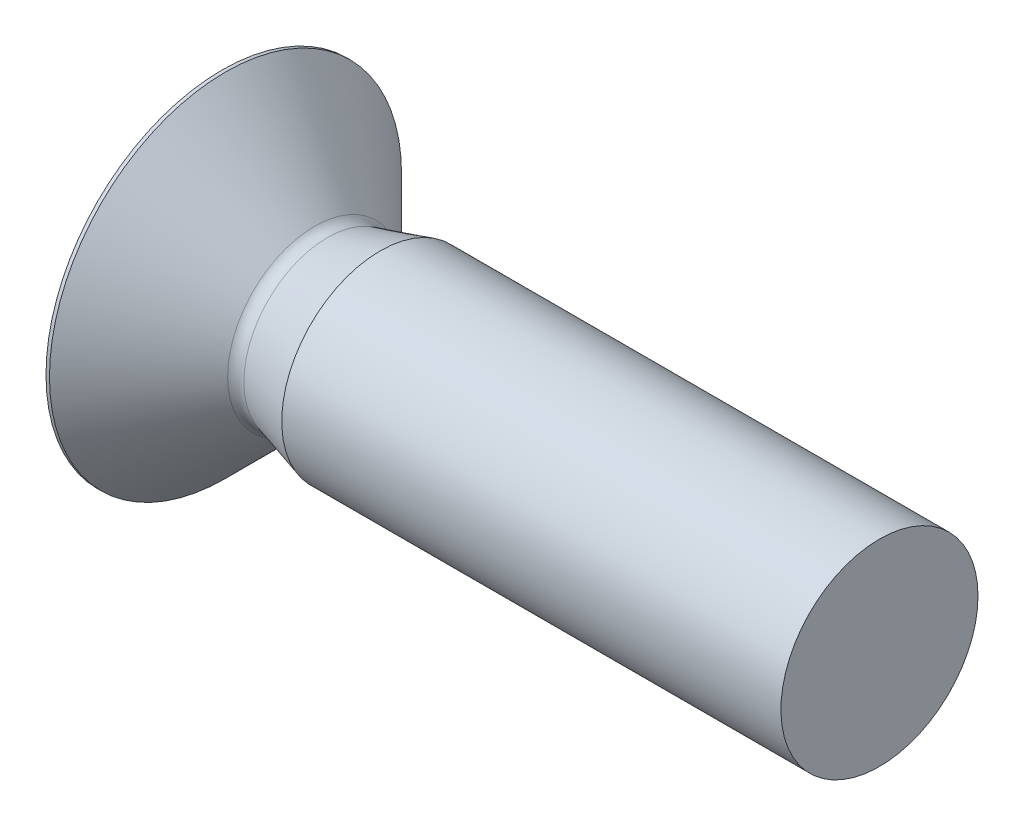
ISO-10303-21;
HEADER;
FILE_DESCRIPTION(('STEP AP214'),'2;1');
FILE_NAME('part.step','',(''),(''),'','','');
FILE_SCHEMA(('AUTOMOTIVE_DESIGN { 1 0 10303 214 1 1 1 1 }'));
ENDSEC;
DATA;
#1=APPLICATION_CONTEXT('core data for automotive mechanical design processes');
#2=APPLICATION_PROTOCOL_DEFINITION('international standard','automotive_design',2000,#1);
#3=PRODUCT_CONTEXT('',#1,'mechanical');
#4=PRODUCT('Part','Part','',(#3));
#5=PRODUCT_RELATED_PRODUCT_CATEGORY('part','',(#4));
#6=PRODUCT_DEFINITION_FORMATION('','',#4);
#7=PRODUCT_DEFINITION_CONTEXT('part definition',#1,'design');
#8=PRODUCT_DEFINITION('design','',#6,#7);
#9=PRODUCT_DEFINITION_SHAPE('','',#8);
#10=(LENGTH_UNIT() NAMED_UNIT(*) SI_UNIT(.MILLI.,.METRE.));
#11=(NAMED_UNIT(*) PLANE_ANGLE_UNIT() SI_UNIT($,.RADIAN.));
#12=(NAMED_UNIT(*) SI_UNIT($,.STERADIAN.) SOLID_ANGLE_UNIT());
#13=UNCERTAINTY_MEASURE_WITH_UNIT(LENGTH_MEASURE(1.E-05),#10,'distance_accuracy_value','');
#14=(GEOMETRIC_REPRESENTATION_CONTEXT(3) GLOBAL_UNCERTAINTY_ASSIGNED_CONTEXT((#13)) GLOBAL_UNIT_ASSIGNED_CONTEXT((#10,
#11,#12)) REPRESENTATION_CONTEXT('',''));
#15=CARTESIAN_POINT('',(0.,0.,0.));
#16=DIRECTION('',(0.,0.,1.));
#17=DIRECTION('',(1.,0.,0.));
#18=AXIS2_PLACEMENT_3D('',#15,#16,#17);
#19=CARTESIAN_POINT('',(13.1071334214584,0.,0.));
#20=DIRECTION('',(0.,0.,1.));
#21=DIRECTION('',(1.,0.,0.));
#22=AXIS2_PLACEMENT_3D('',#19,#20,#21);
#23=SPHERICAL_SURFACE('',#22,13.3871334214584);
#24=CARTESIAN_POINT('',(-0.00899944017152855,0.,0.));
#25=DIRECTION('',(1.,0.,0.));
#26=DIRECTION('',(0.,1.,0.));
#27=AXIS2_PLACEMENT_3D('',#24,#25,#26);
#28=CIRCLE('',#27,2.68);
#29=CARTESIAN_POINT('',(-0.00899944017152888,2.68,0.));
#30=VERTEX_POINT('',#29);
#31=EDGE_CURVE('E133',#30,#30,#28,.F.);
#32=ORIENTED_EDGE('',*,*,#31,.T.);
#33=EDGE_LOOP('',(#32));
#34=FACE_BOUND('',#33,.T.);
#35=CARTESIAN_POINT('',(13.1071334214584,-0.27,0.));
#36=DIRECTION('',(0.,1.,0.));
#37=DIRECTION('',(0.,0.,1.));
#38=AXIS2_PLACEMENT_3D('',#35,#36,#37);
#39=CIRCLE('',#38,13.3844103808845);
#40=CARTESIAN_POINT('',(-0.269022276047835,-0.27,0.47));
#41=VERTEX_POINT('',#40);
#42=CARTESIAN_POINT('',(-0.210260903935423,-0.27,1.3377031157536));
#43=VERTEX_POINT('',#42);
#44=EDGE_CURVE('E148',#41,#43,#39,.T.);
#45=ORIENTED_EDGE('',*,*,#44,.F.);
#46=CARTESIAN_POINT('',(-0.269022276047835,-0.27,0.47));
#47=CARTESIAN_POINT('',(-0.269417604811067,-0.26999042086414,0.458758558443646));
#48=CARTESIAN_POINT('',(-0.269778909741107,-0.270947211608083,0.44751857072811));
#49=CARTESIAN_POINT('',(-0.270424656000757,-0.274724233350607,0.42536218977667));
#50=CARTESIAN_POINT('',(-0.270709154802303,-0.277543065559565,0.414445560056996));
#51=CARTESIAN_POINT('',(-0.271193214650414,-0.284976947318594,0.393233392364227));
#52=CARTESIAN_POINT('',(-0.271392732508175,-0.28959290792535,0.382938172478185));
#53=CARTESIAN_POINT('',(-0.271701015779643,-0.300486494424591,0.363269218343669));
#54=CARTESIAN_POINT('',(-0.271809798340467,-0.306763806060175,0.353895310281603));
#55=CARTESIAN_POINT('',(-0.271933494681876,-0.320798281946317,0.336339697824952));
#56=CARTESIAN_POINT('',(-0.271948472551234,-0.328554432098189,0.328157183186532));
#57=CARTESIAN_POINT('',(-0.271884294423208,-0.345330886304446,0.313207627603959));
#58=CARTESIAN_POINT('',(-0.271805120395095,-0.354351432207329,0.306440858076476));
#59=CARTESIAN_POINT('',(-0.271554920408947,-0.373396806769295,0.294517566400965));
#60=CARTESIAN_POINT('',(-0.271383904227269,-0.383421528444114,0.289360872956922));
#61=CARTESIAN_POINT('',(-0.270954875852803,-0.404190180601211,0.280804286942104));
#62=CARTESIAN_POINT('',(-0.27069691305696,-0.414933699941671,0.277403399617276));
#63=CARTESIAN_POINT('',(-0.270202563341986,-0.433117931607286,0.273289762319187));
#64=CARTESIAN_POINT('',(-0.26998842314607,-0.440445829814385,0.272056778841486));
#65=CARTESIAN_POINT('',(-0.269528466888535,-0.455181650474478,0.270411990437571));
#66=CARTESIAN_POINT('',(-0.26928269629425,-0.462589444342723,0.269999020510423));
#67=CARTESIAN_POINT('',(-0.26902227604817,-0.469999999999803,0.269999999999089));
#68=B_SPLINE_CURVE_WITH_KNOTS('',3,(#46,#47,#48,#49,#50,#51,#52,#53,#54,#55,#56,#57,#58,#59,#60,
#61,#62,#63,#64,#65,#66,#67),.UNSPECIFIED.,.F.,.F.,(4,2,2,2,2,2,2,2,2,2,4),(0.,
0.0337007137509255,0.0673761398364029,0.101068660001112,0.134754811524532,0.168417945650886,
0.20208752753428,0.235753526088899,0.26940043014304,0.291659571944836,0.31388706728416),.UNSPECIFIED.);
#69=CARTESIAN_POINT('',(-0.269022276047835,-0.47,0.27));
#70=VERTEX_POINT('',#69);
#71=EDGE_CURVE('E223',#41,#70,#68,.T.);
#72=ORIENTED_EDGE('',*,*,#71,.T.);
#73=CARTESIAN_POINT('',(13.1071334214584,0.,0.27));
#74=DIRECTION('',(0.,0.,-1.));
#75=DIRECTION('',(0.,1.,0.));
#76=AXIS2_PLACEMENT_3D('',#73,#74,#75);
#77=CIRCLE('',#76,13.3844103808845);
#78=CARTESIAN_POINT('',(-0.210260903935423,-1.3377031157536,0.27));
#79=VERTEX_POINT('',#78);
#80=EDGE_CURVE('E186',#79,#70,#77,.T.);
#81=ORIENTED_EDGE('',*,*,#80,.F.);
#82=CARTESIAN_POINT('',(12.9343255522844,0.98004212673304,0.));
#83=DIRECTION('',(-0.173648177666931,0.984807753012208,0.));
#84=DIRECTION('',(-0.984807753012208,-0.173648177666931,0.));
#85=AXIS2_PLACEMENT_3D('',#82,#83,#84);
#86=CIRCLE('',#85,13.3500934870924);
#87=CARTESIAN_POINT('',(-0.210260903935423,-1.3377031157536,-0.270000000000001));
#88=VERTEX_POINT('',#87);
#89=EDGE_CURVE('E184',#88,#79,#86,.T.);
#90=ORIENTED_EDGE('',*,*,#89,.F.);
#91=CARTESIAN_POINT('',(13.1071334214584,0.,-0.270000000000001));
#92=DIRECTION('',(0.,0.,1.));
#93=DIRECTION('',(0.,-1.,0.));
#94=AXIS2_PLACEMENT_3D('',#91,#92,#93);
#95=CIRCLE('',#94,13.3844103808845);
#96=CARTESIAN_POINT('',(-0.269022276047835,-0.47,-0.270000000000001));
#97=VERTEX_POINT('',#96);
#98=EDGE_CURVE('E187',#97,#88,#95,.T.);
#99=ORIENTED_EDGE('',*,*,#98,.F.);
#100=CARTESIAN_POINT('',(-0.269022276047835,-0.47,-0.270000000000001));
#101=CARTESIAN_POINT('',(-0.269417604811068,-0.458758558443646,-0.26999042086414));
#102=CARTESIAN_POINT('',(-0.269778909741108,-0.447518570728111,-0.270947211608084));
#103=CARTESIAN_POINT('',(-0.270424656000757,-0.425362189776671,-0.274724233350608));
#104=CARTESIAN_POINT('',(-0.270709154802303,-0.414445560056996,-0.277543065559565));
#105=CARTESIAN_POINT('',(-0.271193214650414,-0.393233392364227,-0.284976947318594));
#106=CARTESIAN_POINT('',(-0.271392732508176,-0.382938172478185,-0.289592907925351));
#107=CARTESIAN_POINT('',(-0.271701015779643,-0.363269218343669,-0.300486494424591));
#108=CARTESIAN_POINT('',(-0.271809798340465,-0.353895310281603,-0.306763806060176));
#109=CARTESIAN_POINT('',(-0.271933494681874,-0.336339697824953,-0.320798281946318));
#110=CARTESIAN_POINT('',(-0.271948472551234,-0.328157183186532,-0.32855443209819));
#111=CARTESIAN_POINT('',(-0.271884294423209,-0.313207627603959,-0.345330886304446));
#112=CARTESIAN_POINT('',(-0.271805120395095,-0.306440858076477,-0.35435143220733));
#113=CARTESIAN_POINT('',(-0.271554920408947,-0.294517566400965,-0.373396806769295));
#114=CARTESIAN_POINT('',(-0.271383904227269,-0.289360872956922,-0.383421528444114));
#115=CARTESIAN_POINT('',(-0.270954875852803,-0.280804286942105,-0.404190180601211));
#116=CARTESIAN_POINT('',(-0.27069691305696,-0.277403399617277,-0.414933699941672));
#117=CARTESIAN_POINT('',(-0.270202563341986,-0.273289762319187,-0.433117931607287));
#118=CARTESIAN_POINT('',(-0.26998842314607,-0.272056778841487,-0.440445829814386));
#119=CARTESIAN_POINT('',(-0.269528466888535,-0.270411990437571,-0.455181650474478));
#120=CARTESIAN_POINT('',(-0.26928269629425,-0.269999020510424,-0.462589444342724));
#121=CARTESIAN_POINT('',(-0.26902227604817,-0.269999999999089,-0.469999999999804));
#122=B_SPLINE_CURVE_WITH_KNOTS('',3,(#100,#101,#102,#103,#104,#105,#106,#107,#108,#109,#110,
#111,#112,#113,#114,#115,#116,#117,#118,#119,#120,#121),.UNSPECIFIED.,.F.,.F.,(4,2,2,2,2,2,2,2,
2,2,4),(0.,0.0337007137509256,0.067376139836403,0.101068660001112,0.134754811524532,
0.168417945650886,0.20208752753428,0.235753526088899,0.26940043014304,0.291659571944836,
0.31388706728416),.UNSPECIFIED.);
#123=CARTESIAN_POINT('',(-0.269022276047835,-0.27,-0.47));
#124=VERTEX_POINT('',#123);
#125=EDGE_CURVE('E232',#97,#124,#122,.T.);
#126=ORIENTED_EDGE('',*,*,#125,.T.);
#127=CARTESIAN_POINT('',(13.1071334214584,-0.27,0.));
#128=DIRECTION('',(0.,1.,0.));
#129=DIRECTION('',(0.,0.,1.));
#130=AXIS2_PLACEMENT_3D('',#127,#128,#129);
#131=CIRCLE('',#130,13.3844103808845);
#132=CARTESIAN_POINT('',(-0.210260903935423,-0.27,-1.3377031157536));
#133=VERTEX_POINT('',#132);
#134=EDGE_CURVE('E163',#133,#124,#131,.T.);
#135=ORIENTED_EDGE('',*,*,#134,.F.);
#136=CARTESIAN_POINT('',(12.9343255522844,0.,0.98004212673304));
#137=DIRECTION('',(-0.173648177666931,0.,0.984807753012208));
#138=DIRECTION('',(0.984807753012208,0.,0.173648177666931));
#139=AXIS2_PLACEMENT_3D('',#136,#137,#138);
#140=CIRCLE('',#139,13.3500934870924);
#141=CARTESIAN_POINT('',(-0.210260903935423,0.27,-1.3377031157536));
#142=VERTEX_POINT('',#141);
#143=EDGE_CURVE('E161',#142,#133,#140,.T.);
#144=ORIENTED_EDGE('',*,*,#143,.F.);
#145=CARTESIAN_POINT('',(13.1071334214584,0.27,0.));
#146=DIRECTION('',(0.,-1.,0.));
#147=DIRECTION('',(0.,0.,-1.));
#148=AXIS2_PLACEMENT_3D('',#145,#146,#147);
#149=CIRCLE('',#148,13.3844103808845);
#150=CARTESIAN_POINT('',(-0.269022276047835,0.27,-0.47));
#151=VERTEX_POINT('',#150);
#152=EDGE_CURVE('E164',#151,#142,#149,.T.);
#153=ORIENTED_EDGE('',*,*,#152,.F.);
#154=CARTESIAN_POINT('',(-0.269022276047835,0.27,-0.47));
#155=CARTESIAN_POINT('',(-0.269417604811067,0.269990420864139,-0.458758558443647));
#156=CARTESIAN_POINT('',(-0.269778909741107,0.270947211608083,-0.447518570728111));
#157=CARTESIAN_POINT('',(-0.270424656000757,0.274724233350607,-0.425362189776671));
#158=CARTESIAN_POINT('',(-0.270709154802303,0.277543065559565,-0.414445560056997));
#159=CARTESIAN_POINT('',(-0.271193214650414,0.284976947318594,-0.393233392364228));
#160=CARTESIAN_POINT('',(-0.271392732508175,0.28959290792535,-0.382938172478186));
#161=CARTESIAN_POINT('',(-0.271701015779643,0.30048649442459,-0.36326921834367));
#162=CARTESIAN_POINT('',(-0.271809798340467,0.306763806060175,-0.353895310281604));
#163=CARTESIAN_POINT('',(-0.271933494681876,0.320798281946317,-0.336339697824953));
#164=CARTESIAN_POINT('',(-0.271948472551234,0.328554432098189,-0.328157183186533));
#165=CARTESIAN_POINT('',(-0.271884294423208,0.345330886304446,-0.313207627603959));
#166=CARTESIAN_POINT('',(-0.271805120395095,0.354351432207329,-0.306440858076477));
#167=CARTESIAN_POINT('',(-0.271554920408947,0.373396806769294,-0.294517566400966));
#168=CARTESIAN_POINT('',(-0.271383904227269,0.383421528444114,-0.289360872956922));
#169=CARTESIAN_POINT('',(-0.270954875852803,0.404190180601211,-0.280804286942105));
#170=CARTESIAN_POINT('',(-0.27069691305696,0.414933699941671,-0.277403399617277));
#171=CARTESIAN_POINT('',(-0.270202563341986,0.433117931607286,-0.273289762319188));
#172=CARTESIAN_POINT('',(-0.26998842314607,0.440445829814385,-0.272056778841487));
#173=CARTESIAN_POINT('',(-0.269528466888535,0.455181650474477,-0.270411990437572));
#174=CARTESIAN_POINT('',(-0.26928269629425,0.462589444342723,-0.269999020510424));
#175=CARTESIAN_POINT('',(-0.26902227604817,0.469999999999803,-0.26999999999909));
#176=B_SPLINE_CURVE_WITH_KNOTS('',3,(#154,#155,#156,#157,#158,#159,#160,#161,#162,#163,#164,
#165,#166,#167,#168,#169,#170,#171,#172,#173,#174,#175),.UNSPECIFIED.,.F.,.F.,(4,2,2,2,2,2,2,2,
2,2,4),(0.,0.0337007137509255,0.0673761398364029,0.101068660001112,0.134754811524532,
0.168417945650886,0.20208752753428,0.235753526088899,0.26940043014304,0.291659571944836,
0.31388706728416),.UNSPECIFIED.);
#177=CARTESIAN_POINT('',(-0.269022276047835,0.47,-0.27));
#178=VERTEX_POINT('',#177);
#179=EDGE_CURVE('E250',#151,#178,#176,.T.);
#180=ORIENTED_EDGE('',*,*,#179,.T.);
#181=CARTESIAN_POINT('',(13.1071334214584,0.,-0.270000000000001));
#182=DIRECTION('',(0.,0.,1.));
#183=DIRECTION('',(0.,-1.,0.));
#184=AXIS2_PLACEMENT_3D('',#181,#182,#183);
#185=CIRCLE('',#184,13.3844103808845);
#186=CARTESIAN_POINT('',(-0.210260903935423,1.3377031157536,-0.27));
#187=VERTEX_POINT('',#186);
#188=EDGE_CURVE('E175',#187,#178,#185,.T.);
#189=ORIENTED_EDGE('',*,*,#188,.F.);
#190=CARTESIAN_POINT('',(12.9343255522844,-0.98004212673304,0.));
#191=DIRECTION('',(-0.173648177666931,-0.984807753012208,0.));
#192=DIRECTION('',(0.984807753012208,-0.173648177666931,0.));
#193=AXIS2_PLACEMENT_3D('',#190,#191,#192);
#194=CIRCLE('',#193,13.3500934870924);
#195=CARTESIAN_POINT('',(-0.210260903935423,1.3377031157536,0.269999999999999));
#196=VERTEX_POINT('',#195);
#197=EDGE_CURVE('E173',#196,#187,#194,.T.);
#198=ORIENTED_EDGE('',*,*,#197,.F.);
#199=CARTESIAN_POINT('',(13.1071334214584,0.,0.27));
#200=DIRECTION('',(0.,0.,-1.));
#201=DIRECTION('',(0.,1.,0.));
#202=AXIS2_PLACEMENT_3D('',#199,#200,#201);
#203=CIRCLE('',#202,13.3844103808845);
#204=CARTESIAN_POINT('',(-0.269022276047835,0.47,0.27));
#205=VERTEX_POINT('',#204);
#206=EDGE_CURVE('E189',#205,#196,#203,.T.);
#207=ORIENTED_EDGE('',*,*,#206,.F.);
#208=CARTESIAN_POINT('',(-0.269022276047835,0.47,0.27));
#209=CARTESIAN_POINT('',(-0.269417604811067,0.458758558443646,0.269990420864139));
#210=CARTESIAN_POINT('',(-0.269778909741107,0.447518570728111,0.270947211608083));
#211=CARTESIAN_POINT('',(-0.270424656000757,0.425362189776671,0.274724233350607));
#212=CARTESIAN_POINT('',(-0.270709154802303,0.414445560056996,0.277543065559565));
#213=CARTESIAN_POINT('',(-0.271193214650414,0.393233392364227,0.284976947318594));
#214=CARTESIAN_POINT('',(-0.271392732508175,0.382938172478185,0.28959290792535));
#215=CARTESIAN_POINT('',(-0.271701015779643,0.363269218343669,0.30048649442459));
#216=CARTESIAN_POINT('',(-0.271809798340467,0.353895310281604,0.306763806060175));
#217=CARTESIAN_POINT('',(-0.271933494681876,0.336339697824953,0.320798281946317));
#218=CARTESIAN_POINT('',(-0.271948472551234,0.328157183186532,0.328554432098189));
#219=CARTESIAN_POINT('',(-0.271884294423208,0.313207627603959,0.345330886304446));
#220=CARTESIAN_POINT('',(-0.271805120395095,0.306440858076477,0.354351432207329));
#221=CARTESIAN_POINT('',(-0.271554920408947,0.294517566400965,0.373396806769294));
#222=CARTESIAN_POINT('',(-0.271383904227269,0.289360872956922,0.383421528444114));
#223=CARTESIAN_POINT('',(-0.270954875852803,0.280804286942105,0.404190180601211));
#224=CARTESIAN_POINT('',(-0.27069691305696,0.277403399617277,0.414933699941671));
#225=CARTESIAN_POINT('',(-0.270202563341986,0.273289762319187,0.433117931607286));
#226=CARTESIAN_POINT('',(-0.26998842314607,0.272056778841487,0.440445829814385));
#227=CARTESIAN_POINT('',(-0.269528466888535,0.270411990437571,0.455181650474477));
#228=CARTESIAN_POINT('',(-0.269282696294251,0.269999020510424,0.462589444342723));
#229=CARTESIAN_POINT('',(-0.26902227604817,0.26999999999909,0.469999999999803));
#230=B_SPLINE_CURVE_WITH_KNOTS('',3,(#208,#209,#210,#211,#212,#213,#214,#215,#216,#217,#218,
#219,#220,#221,#222,#223,#224,#225,#226,#227,#228,#229),.UNSPECIFIED.,.F.,.F.,(4,2,2,2,2,2,2,2,
2,2,4),(0.,0.0337007137509255,0.067376139836403,0.101068660001112,0.134754811524532,
0.168417945650886,0.20208752753428,0.235753526088899,0.26940043014304,0.291659571944836,
0.313887067284161),.UNSPECIFIED.);
#231=CARTESIAN_POINT('',(-0.269022276047835,0.27,0.47));
#232=VERTEX_POINT('',#231);
#233=EDGE_CURVE('E258',#205,#232,#230,.T.);
#234=ORIENTED_EDGE('',*,*,#233,.T.);
#235=CARTESIAN_POINT('',(13.1071334214584,0.27,0.));
#236=DIRECTION('',(0.,-1.,0.));
#237=DIRECTION('',(0.,0.,-1.));
#238=AXIS2_PLACEMENT_3D('',#235,#236,#237);
#239=CIRCLE('',#238,13.3844103808845);
#240=CARTESIAN_POINT('',(-0.210260903935423,0.27,1.3377031157536));
#241=VERTEX_POINT('',#240);
#242=EDGE_CURVE('E147',#241,#232,#239,.T.);
#243=ORIENTED_EDGE('',*,*,#242,.F.);
#244=CARTESIAN_POINT('',(12.9343255522844,0.,-0.98004212673304));
#245=DIRECTION('',(-0.173648177666931,0.,-0.984807753012208));
#246=DIRECTION('',(-0.984807753012208,0.,0.173648177666931));
#247=AXIS2_PLACEMENT_3D('',#244,#245,#246);
#248=CIRCLE('',#247,13.3500934870924);
#249=EDGE_CURVE('E132',#43,#241,#248,.T.);
#250=ORIENTED_EDGE('',*,*,#249,.F.);
#251=EDGE_LOOP('',(#45,#72,#81,#90,#99,#126,#135,#144,#153,#180,#189,#198,#207,#234,#243,#250));
#252=FACE_BOUND('',#251,.T.);
#253=ADVANCED_FACE('F40',(#34,#252),#23,.T.);
#254=CARTESIAN_POINT('',(1.4,0.,0.));
#255=DIRECTION('',(-1.,0.,0.));
#256=DIRECTION('',(0.,1.,0.));
#257=AXIS2_PLACEMENT_3D('',#254,#255,#256);
#258=CONICAL_SURFACE('',#257,1.32367301929153,0.78539816339745);
#259=CARTESIAN_POINT('',(0.0436730192915394,0.,0.));
#260=DIRECTION('',(-1.,0.,0.));
#261=DIRECTION('',(0.,0.,1.));
#262=AXIS2_PLACEMENT_3D('',#259,#260,#261);
#263=CIRCLE('',#262,2.68);
#264=CARTESIAN_POINT('',(0.0436730192915394,0.,2.68));
#265=VERTEX_POINT('',#264);
#266=EDGE_CURVE('E338',#265,#265,#263,.F.);
#267=ORIENTED_EDGE('',*,*,#266,.T.);
#268=EDGE_LOOP('',(#267));
#269=FACE_BOUND('',#268,.T.);
#270=CARTESIAN_POINT('',(1.4,0.,0.));
#271=DIRECTION('',(-1.,0.,0.));
#272=DIRECTION('',(0.,0.,1.));
#273=AXIS2_PLACEMENT_3D('',#270,#271,#272);
#274=CIRCLE('',#273,1.32367301929153);
#275=CARTESIAN_POINT('',(1.4,0.,1.32367301929153));
#276=VERTEX_POINT('',#275);
#277=EDGE_CURVE('E427',#276,#276,#274,.T.);
#278=ORIENTED_EDGE('',*,*,#277,.T.);
#279=EDGE_LOOP('',(#278));
#280=FACE_BOUND('',#279,.T.);
#281=ADVANCED_FACE('F244',(#269,#280),#258,.T.);
#282=CARTESIAN_POINT('',(10.,0.,0.));
#283=DIRECTION('',(1.,0.,0.));
#284=DIRECTION('',(0.,1.,0.));
#285=AXIS2_PLACEMENT_3D('',#282,#283,#284);
#286=CYLINDRICAL_SURFACE('',#285,2.68);
#287=ORIENTED_EDGE('',*,*,#31,.F.);
#288=EDGE_LOOP('',(#287));
#289=FACE_BOUND('',#288,.T.);
#290=ORIENTED_EDGE('',*,*,#266,.F.);
#291=EDGE_LOOP('',(#290));
#292=FACE_BOUND('',#291,.T.);
#293=ADVANCED_FACE('F404',(#289,#292),#286,.T.);
#294=CARTESIAN_POINT('',(1.12,1.35,0.269999999999999));
#295=DIRECTION('',(0.,0.,-1.));
#296=DIRECTION('',(0.,1.,0.));
#297=AXIS2_PLACEMENT_3D('',#294,#295,#296);
#298=PLANE('',#297);
#299=DIRECTION('',(0.,-1.,0.));
#300=VECTOR('',#299,1.);
#301=CARTESIAN_POINT('',(1.12,1.35,0.269999999999999));
#302=LINE('',#301,#300);
#303=CARTESIAN_POINT('',(1.12,1.10314222700815,0.27));
#304=VERTEX_POINT('',#303);
#305=CARTESIAN_POINT('',(1.12,0.47,0.27));
#306=VERTEX_POINT('',#305);
#307=EDGE_CURVE('E124',#304,#306,#302,.T.);
#308=ORIENTED_EDGE('',*,*,#307,.T.);
#309=DIRECTION('',(-1.,0.,0.));
#310=VECTOR('',#309,1.);
#311=CARTESIAN_POINT('',(1.12,0.47,0.27));
#312=LINE('',#311,#310);
#313=EDGE_CURVE('E211',#306,#205,#312,.T.);
#314=ORIENTED_EDGE('',*,*,#313,.T.);
#315=ORIENTED_EDGE('',*,*,#206,.T.);
#316=DIRECTION('',(-0.984807753012208,0.173648177666931,0.));
#317=VECTOR('',#316,1.);
#318=CARTESIAN_POINT('',(1.07778483455014,1.11058589967203,0.27));
#319=LINE('',#318,#317);
#320=EDGE_CURVE('E167',#304,#196,#319,.T.);
#321=ORIENTED_EDGE('',*,*,#320,.F.);
#322=EDGE_LOOP('',(#308,#314,#315,#321));
#323=FACE_BOUND('',#322,.T.);
#324=ADVANCED_FACE('F371',(#323),#298,.T.);
#325=CARTESIAN_POINT('',(1.12,0.27,1.35));
#326=DIRECTION('',(0.,-1.,0.));
#327=DIRECTION('',(0.,0.,-1.));
#328=AXIS2_PLACEMENT_3D('',#325,#326,#327);
#329=PLANE('',#328);
#330=ORIENTED_EDGE('',*,*,#242,.T.);
#331=DIRECTION('',(-1.,0.,0.));
#332=VECTOR('',#331,1.);
#333=CARTESIAN_POINT('',(1.12,0.27,0.47));
#334=LINE('',#333,#332);
#335=CARTESIAN_POINT('',(1.12,0.27,0.47));
#336=VERTEX_POINT('',#335);
#337=EDGE_CURVE('E118',#232,#336,#334,.F.);
#338=ORIENTED_EDGE('',*,*,#337,.T.);
#339=DIRECTION('',(0.,0.,1.));
#340=VECTOR('',#339,1.);
#341=CARTESIAN_POINT('',(1.12,0.27,1.35));
#342=LINE('',#341,#340);
#343=CARTESIAN_POINT('',(1.12,0.27,1.10314222700815));
#344=VERTEX_POINT('',#343);
#345=EDGE_CURVE('E112',#336,#344,#342,.T.);
#346=ORIENTED_EDGE('',*,*,#345,.T.);
#347=DIRECTION('',(-0.984807753012208,0.,0.173648177666931));
#348=VECTOR('',#347,1.);
#349=CARTESIAN_POINT('',(-0.28,0.27,1.35));
#350=LINE('',#349,#348);
#351=EDGE_CURVE('E44',#344,#241,#350,.T.);
#352=ORIENTED_EDGE('',*,*,#351,.T.);
#353=EDGE_LOOP('',(#330,#338,#346,#352));
#354=FACE_BOUND('',#353,.T.);
#355=ADVANCED_FACE('F115',(#354),#329,.T.);
#356=CARTESIAN_POINT('',(-0.28,0.,1.35));
#357=DIRECTION('',(-0.173648177666931,0.,-0.984807753012208));
#358=DIRECTION('',(-0.984807753012208,0.,0.173648177666931));
#359=AXIS2_PLACEMENT_3D('',#356,#357,#358);
#360=PLANE('',#359);
#361=ORIENTED_EDGE('',*,*,#249,.T.);
#362=ORIENTED_EDGE('',*,*,#351,.F.);
#363=DIRECTION('',(0.,-1.,0.));
#364=VECTOR('',#363,1.);
#365=CARTESIAN_POINT('',(1.12,0.,1.10314222700815));
#366=LINE('',#365,#364);
#367=CARTESIAN_POINT('',(1.12,-0.27,1.10314222700815));
#368=VERTEX_POINT('',#367);
#369=EDGE_CURVE('E123',#344,#368,#366,.T.);
#370=ORIENTED_EDGE('',*,*,#369,.T.);
#371=DIRECTION('',(-0.984807753012208,0.,0.173648177666931));
#372=VECTOR('',#371,1.);
#373=CARTESIAN_POINT('',(1.07778483455014,-0.27,1.11058589967203));
#374=LINE('',#373,#372);
#375=EDGE_CURVE('E134',#368,#43,#374,.T.);
#376=ORIENTED_EDGE('',*,*,#375,.T.);
#377=EDGE_LOOP('',(#361,#362,#370,#376));
#378=FACE_BOUND('',#377,.T.);
#379=ADVANCED_FACE('F128',(#378),#360,.T.);
#380=CARTESIAN_POINT('',(1.12,-0.27,1.35));
#381=DIRECTION('',(0.,1.,0.));
#382=DIRECTION('',(0.,0.,1.));
#383=AXIS2_PLACEMENT_3D('',#380,#381,#382);
#384=PLANE('',#383);
#385=DIRECTION('',(0.,0.,-1.));
#386=VECTOR('',#385,1.);
#387=CARTESIAN_POINT('',(1.12,-0.27,1.35));
#388=LINE('',#387,#386);
#389=CARTESIAN_POINT('',(1.12,-0.27,0.47));
#390=VERTEX_POINT('',#389);
#391=EDGE_CURVE('E140',#368,#390,#388,.T.);
#392=ORIENTED_EDGE('',*,*,#391,.T.);
#393=DIRECTION('',(-1.,0.,0.));
#394=VECTOR('',#393,1.);
#395=CARTESIAN_POINT('',(1.12,-0.27,0.47));
#396=LINE('',#395,#394);
#397=EDGE_CURVE('E196',#390,#41,#396,.T.);
#398=ORIENTED_EDGE('',*,*,#397,.T.);
#399=ORIENTED_EDGE('',*,*,#44,.T.);
#400=ORIENTED_EDGE('',*,*,#375,.F.);
#401=EDGE_LOOP('',(#392,#398,#399,#400));
#402=FACE_BOUND('',#401,.T.);
#403=ADVANCED_FACE('F284',(#402),#384,.T.);
#404=CARTESIAN_POINT('',(1.12,-0.27,0.27));
#405=DIRECTION('',(0.,0.,-1.));
#406=DIRECTION('',(0.,1.,0.));
#407=AXIS2_PLACEMENT_3D('',#404,#405,#406);
#408=PLANE('',#407);
#409=ORIENTED_EDGE('',*,*,#80,.T.);
#410=DIRECTION('',(-1.,0.,0.));
#411=VECTOR('',#410,1.);
#412=CARTESIAN_POINT('',(1.12,-0.47,0.27));
#413=LINE('',#412,#411);
#414=CARTESIAN_POINT('',(1.12,-0.47,0.27));
#415=VERTEX_POINT('',#414);
#416=EDGE_CURVE('E220',#70,#415,#413,.F.);
#417=ORIENTED_EDGE('',*,*,#416,.T.);
#418=DIRECTION('',(0.,-1.,0.));
#419=VECTOR('',#418,1.);
#420=CARTESIAN_POINT('',(1.12,-0.27,0.27));
#421=LINE('',#420,#419);
#422=CARTESIAN_POINT('',(1.12,-1.10314222700815,0.27));
#423=VERTEX_POINT('',#422);
#424=EDGE_CURVE('E141',#415,#423,#421,.T.);
#425=ORIENTED_EDGE('',*,*,#424,.T.);
#426=DIRECTION('',(-0.984807753012208,-0.173648177666931,0.));
#427=VECTOR('',#426,1.);
#428=CARTESIAN_POINT('',(-0.28,-1.35,0.269999999999999));
#429=LINE('',#428,#427);
#430=EDGE_CURVE('E145',#423,#79,#429,.T.);
#431=ORIENTED_EDGE('',*,*,#430,.T.);
#432=EDGE_LOOP('',(#409,#417,#425,#431));
#433=FACE_BOUND('',#432,.T.);
#434=ADVANCED_FACE('F281',(#433),#408,.T.);
#435=CARTESIAN_POINT('',(-0.28,-1.35,0.));
#436=DIRECTION('',(-0.173648177666931,0.984807753012208,0.));
#437=DIRECTION('',(-0.984807753012208,-0.173648177666931,0.));
#438=AXIS2_PLACEMENT_3D('',#435,#436,#437);
#439=PLANE('',#438);
#440=ORIENTED_EDGE('',*,*,#89,.T.);
#441=ORIENTED_EDGE('',*,*,#430,.F.);
#442=DIRECTION('',(0.,0.,-1.));
#443=VECTOR('',#442,1.);
#444=CARTESIAN_POINT('',(1.12,-1.10314222700815,0.));
#445=LINE('',#444,#443);
#446=CARTESIAN_POINT('',(1.12,-1.10314222700815,-0.270000000000001));
#447=VERTEX_POINT('',#446);
#448=EDGE_CURVE('E179',#423,#447,#445,.T.);
#449=ORIENTED_EDGE('',*,*,#448,.T.);
#450=DIRECTION('',(-0.984807753012208,-0.173648177666931,0.));
#451=VECTOR('',#450,1.);
#452=CARTESIAN_POINT('',(1.262475711946,-1.07801991489642,-0.270000000000001));
#453=LINE('',#452,#451);
#454=EDGE_CURVE('E152',#447,#88,#453,.T.);
#455=ORIENTED_EDGE('',*,*,#454,.T.);
#456=EDGE_LOOP('',(#440,#441,#449,#455));
#457=FACE_BOUND('',#456,.T.);
#458=ADVANCED_FACE('F277',(#457),#439,.T.);
#459=CARTESIAN_POINT('',(1.12,-0.27,-0.270000000000001));
#460=DIRECTION('',(0.,0.,1.));
#461=DIRECTION('',(0.,-1.,0.));
#462=AXIS2_PLACEMENT_3D('',#459,#460,#461);
#463=PLANE('',#462);
#464=DIRECTION('',(0.,1.,0.));
#465=VECTOR('',#464,1.);
#466=CARTESIAN_POINT('',(1.12,-0.27,-0.270000000000001));
#467=LINE('',#466,#465);
#468=CARTESIAN_POINT('',(1.12,-0.47,-0.270000000000001));
#469=VERTEX_POINT('',#468);
#470=EDGE_CURVE('E181',#447,#469,#467,.T.);
#471=ORIENTED_EDGE('',*,*,#470,.T.);
#472=DIRECTION('',(-1.,0.,0.));
#473=VECTOR('',#472,1.);
#474=CARTESIAN_POINT('',(1.12,-0.47,-0.270000000000001));
#475=LINE('',#474,#473);
#476=EDGE_CURVE('E217',#469,#97,#475,.T.);
#477=ORIENTED_EDGE('',*,*,#476,.T.);
#478=ORIENTED_EDGE('',*,*,#98,.T.);
#479=ORIENTED_EDGE('',*,*,#454,.F.);
#480=EDGE_LOOP('',(#471,#477,#478,#479));
#481=FACE_BOUND('',#480,.T.);
#482=ADVANCED_FACE('F280',(#481),#463,.T.);
#483=CARTESIAN_POINT('',(1.12,-0.27,-0.270000000000001));
#484=DIRECTION('',(0.,1.,0.));
#485=DIRECTION('',(0.,0.,1.));
#486=AXIS2_PLACEMENT_3D('',#483,#484,#485);
#487=PLANE('',#486);
#488=ORIENTED_EDGE('',*,*,#134,.T.);
#489=DIRECTION('',(-1.,0.,0.));
#490=VECTOR('',#489,1.);
#491=CARTESIAN_POINT('',(1.12,-0.27,-0.47));
#492=LINE('',#491,#490);
#493=CARTESIAN_POINT('',(1.12,-0.27,-0.47));
#494=VERTEX_POINT('',#493);
#495=EDGE_CURVE('E214',#124,#494,#492,.F.);
#496=ORIENTED_EDGE('',*,*,#495,.T.);
#497=DIRECTION('',(0.,0.,-1.));
#498=VECTOR('',#497,1.);
#499=CARTESIAN_POINT('',(1.12,-0.27,-0.270000000000001));
#500=LINE('',#499,#498);
#501=CARTESIAN_POINT('',(1.12,-0.27,-1.10314222700815));
#502=VERTEX_POINT('',#501);
#503=EDGE_CURVE('E157',#494,#502,#500,.T.);
#504=ORIENTED_EDGE('',*,*,#503,.T.);
#505=DIRECTION('',(-0.984807753012208,0.,-0.173648177666931));
#506=VECTOR('',#505,1.);
#507=CARTESIAN_POINT('',(-0.28,-0.27,-1.35));
#508=LINE('',#507,#506);
#509=EDGE_CURVE('E149',#502,#133,#508,.T.);
#510=ORIENTED_EDGE('',*,*,#509,.T.);
#511=EDGE_LOOP('',(#488,#496,#504,#510));
#512=FACE_BOUND('',#511,.T.);
#513=ADVANCED_FACE('F288',(#512),#487,.T.);
#514=CARTESIAN_POINT('',(-0.28,0.,-1.35));
#515=DIRECTION('',(-0.173648177666931,0.,0.984807753012208));
#516=DIRECTION('',(0.984807753012208,0.,0.173648177666931));
#517=AXIS2_PLACEMENT_3D('',#514,#515,#516);
#518=PLANE('',#517);
#519=ORIENTED_EDGE('',*,*,#143,.T.);
#520=ORIENTED_EDGE('',*,*,#509,.F.);
#521=DIRECTION('',(0.,1.,0.));
#522=VECTOR('',#521,1.);
#523=CARTESIAN_POINT('',(1.12,0.,-1.10314222700815));
#524=LINE('',#523,#522);
#525=CARTESIAN_POINT('',(1.12,0.27,-1.10314222700815));
#526=VERTEX_POINT('',#525);
#527=EDGE_CURVE('E154',#502,#526,#524,.T.);
#528=ORIENTED_EDGE('',*,*,#527,.T.);
#529=DIRECTION('',(-0.984807753012208,0.,-0.173648177666931));
#530=VECTOR('',#529,1.);
#531=CARTESIAN_POINT('',(1.262475711946,0.27,-1.07801991489642));
#532=LINE('',#531,#530);
#533=EDGE_CURVE('E153',#526,#142,#532,.T.);
#534=ORIENTED_EDGE('',*,*,#533,.T.);
#535=EDGE_LOOP('',(#519,#520,#528,#534));
#536=FACE_BOUND('',#535,.T.);
#537=ADVANCED_FACE('F285',(#536),#518,.T.);
#538=CARTESIAN_POINT('',(1.12,0.27,-0.270000000000001));
#539=DIRECTION('',(0.,-1.,0.));
#540=DIRECTION('',(0.,0.,-1.));
#541=AXIS2_PLACEMENT_3D('',#538,#539,#540);
#542=PLANE('',#541);
#543=DIRECTION('',(0.,0.,1.));
#544=VECTOR('',#543,1.);
#545=CARTESIAN_POINT('',(1.12,0.27,-0.270000000000001));
#546=LINE('',#545,#544);
#547=CARTESIAN_POINT('',(1.12,0.27,-0.47));
#548=VERTEX_POINT('',#547);
#549=EDGE_CURVE('E156',#526,#548,#546,.T.);
#550=ORIENTED_EDGE('',*,*,#549,.T.);
#551=DIRECTION('',(-1.,0.,0.));
#552=VECTOR('',#551,1.);
#553=CARTESIAN_POINT('',(1.12,0.27,-0.47));
#554=LINE('',#553,#552);
#555=EDGE_CURVE('E207',#548,#151,#554,.T.);
#556=ORIENTED_EDGE('',*,*,#555,.T.);
#557=ORIENTED_EDGE('',*,*,#152,.T.);
#558=ORIENTED_EDGE('',*,*,#533,.F.);
#559=EDGE_LOOP('',(#550,#556,#557,#558));
#560=FACE_BOUND('',#559,.T.);
#561=ADVANCED_FACE('F287',(#560),#542,.T.);
#562=CARTESIAN_POINT('',(1.12,1.35,-0.27));
#563=DIRECTION('',(0.,0.,1.));
#564=DIRECTION('',(0.,-1.,0.));
#565=AXIS2_PLACEMENT_3D('',#562,#563,#564);
#566=PLANE('',#565);
#567=ORIENTED_EDGE('',*,*,#188,.T.);
#568=DIRECTION('',(-1.,0.,0.));
#569=VECTOR('',#568,1.);
#570=CARTESIAN_POINT('',(1.12,0.47,-0.27));
#571=LINE('',#570,#569);
#572=CARTESIAN_POINT('',(1.12,0.47,-0.27));
#573=VERTEX_POINT('',#572);
#574=EDGE_CURVE('E59',#178,#573,#571,.F.);
#575=ORIENTED_EDGE('',*,*,#574,.T.);
#576=DIRECTION('',(0.,1.,0.));
#577=VECTOR('',#576,1.);
#578=CARTESIAN_POINT('',(1.12,1.35,-0.27));
#579=LINE('',#578,#577);
#580=CARTESIAN_POINT('',(1.12,1.10314222700815,-0.27));
#581=VERTEX_POINT('',#580);
#582=EDGE_CURVE('E170',#573,#581,#579,.T.);
#583=ORIENTED_EDGE('',*,*,#582,.T.);
#584=DIRECTION('',(-0.984807753012208,0.173648177666931,0.));
#585=VECTOR('',#584,1.);
#586=CARTESIAN_POINT('',(-0.28,1.35,-0.27));
#587=LINE('',#586,#585);
#588=EDGE_CURVE('E160',#581,#187,#587,.T.);
#589=ORIENTED_EDGE('',*,*,#588,.T.);
#590=EDGE_LOOP('',(#567,#575,#583,#589));
#591=FACE_BOUND('',#590,.T.);
#592=ADVANCED_FACE('F294',(#591),#566,.T.);
#593=CARTESIAN_POINT('',(-0.28,1.35,0.));
#594=DIRECTION('',(-0.173648177666931,-0.984807753012208,0.));
#595=DIRECTION('',(0.984807753012208,-0.173648177666931,0.));
#596=AXIS2_PLACEMENT_3D('',#593,#594,#595);
#597=PLANE('',#596);
#598=ORIENTED_EDGE('',*,*,#197,.T.);
#599=ORIENTED_EDGE('',*,*,#588,.F.);
#600=DIRECTION('',(0.,0.,1.));
#601=VECTOR('',#600,1.);
#602=CARTESIAN_POINT('',(1.12,1.10314222700815,0.));
#603=LINE('',#602,#601);
#604=EDGE_CURVE('E168',#581,#304,#603,.T.);
#605=ORIENTED_EDGE('',*,*,#604,.T.);
#606=ORIENTED_EDGE('',*,*,#320,.T.);
#607=EDGE_LOOP('',(#598,#599,#605,#606));
#608=FACE_BOUND('',#607,.T.);
#609=ADVANCED_FACE('F42',(#608),#597,.T.);
#610=CARTESIAN_POINT('',(1.12,0.27,0.27));
#611=DIRECTION('',(1.,0.,0.));
#612=DIRECTION('',(0.,0.,-1.));
#613=AXIS2_PLACEMENT_3D('',#610,#611,#612);
#614=PLANE('',#613);
#615=ORIENTED_EDGE('',*,*,#307,.F.);
#616=ORIENTED_EDGE('',*,*,#604,.F.);
#617=ORIENTED_EDGE('',*,*,#582,.F.);
#618=CARTESIAN_POINT('',(1.12,0.47,-0.47));
#619=DIRECTION('',(1.,0.,0.));
#620=DIRECTION('',(0.,0.,-1.));
#621=AXIS2_PLACEMENT_3D('',#618,#619,#620);
#622=CIRCLE('',#621,0.2);
#623=EDGE_CURVE('E11',#573,#548,#622,.T.);
#624=ORIENTED_EDGE('',*,*,#623,.T.);
#625=ORIENTED_EDGE('',*,*,#549,.F.);
#626=ORIENTED_EDGE('',*,*,#527,.F.);
#627=ORIENTED_EDGE('',*,*,#503,.F.);
#628=CARTESIAN_POINT('',(1.12,-0.47,-0.47));
#629=DIRECTION('',(1.,0.,0.));
#630=DIRECTION('',(0.,0.,-1.));
#631=AXIS2_PLACEMENT_3D('',#628,#629,#630);
#632=CIRCLE('',#631,0.2);
#633=EDGE_CURVE('E201',#494,#469,#632,.T.);
#634=ORIENTED_EDGE('',*,*,#633,.T.);
#635=ORIENTED_EDGE('',*,*,#470,.F.);
#636=ORIENTED_EDGE('',*,*,#448,.F.);
#637=ORIENTED_EDGE('',*,*,#424,.F.);
#638=CARTESIAN_POINT('',(1.12,-0.47,0.47));
#639=DIRECTION('',(1.,0.,0.));
#640=DIRECTION('',(0.,0.,-1.));
#641=AXIS2_PLACEMENT_3D('',#638,#639,#640);
#642=CIRCLE('',#641,0.2);
#643=EDGE_CURVE('E204',#415,#390,#642,.T.);
#644=ORIENTED_EDGE('',*,*,#643,.T.);
#645=ORIENTED_EDGE('',*,*,#391,.F.);
#646=ORIENTED_EDGE('',*,*,#369,.F.);
#647=ORIENTED_EDGE('',*,*,#345,.F.);
#648=CARTESIAN_POINT('',(1.12,0.47,0.47));
#649=DIRECTION('',(1.,0.,0.));
#650=DIRECTION('',(0.,0.,-1.));
#651=AXIS2_PLACEMENT_3D('',#648,#649,#650);
#652=CIRCLE('',#651,0.2);
#653=EDGE_CURVE('E50',#336,#306,#652,.T.);
#654=ORIENTED_EDGE('',*,*,#653,.T.);
#655=EDGE_LOOP('',(#615,#616,#617,#624,#625,#626,#627,#634,#635,#636,#637,#644,#645,#646,#647,#654));
#656=FACE_BOUND('',#655,.T.);
#657=ADVANCED_FACE('F137',(#656),#614,.F.);
#658=CARTESIAN_POINT('',(1.12,-0.47,0.47));
#659=DIRECTION('',(-1.,0.,0.));
#660=DIRECTION('',(0.,0.,1.));
#661=AXIS2_PLACEMENT_3D('',#658,#659,#660);
#662=CYLINDRICAL_SURFACE('',#661,0.2);
#663=ORIENTED_EDGE('',*,*,#643,.F.);
#664=ORIENTED_EDGE('',*,*,#416,.F.);
#665=ORIENTED_EDGE('',*,*,#71,.F.);
#666=ORIENTED_EDGE('',*,*,#397,.F.);
#667=EDGE_LOOP('',(#663,#664,#665,#666));
#668=FACE_BOUND('',#667,.T.);
#669=ADVANCED_FACE('F239',(#668),#662,.T.);
#670=CARTESIAN_POINT('',(1.12,-0.47,-0.47));
#671=DIRECTION('',(-1.,0.,0.));
#672=DIRECTION('',(0.,0.,1.));
#673=AXIS2_PLACEMENT_3D('',#670,#671,#672);
#674=CYLINDRICAL_SURFACE('',#673,0.2);
#675=ORIENTED_EDGE('',*,*,#633,.F.);
#676=ORIENTED_EDGE('',*,*,#495,.F.);
#677=ORIENTED_EDGE('',*,*,#125,.F.);
#678=ORIENTED_EDGE('',*,*,#476,.F.);
#679=EDGE_LOOP('',(#675,#676,#677,#678));
#680=FACE_BOUND('',#679,.T.);
#681=ADVANCED_FACE('F269',(#680),#674,.T.);
#682=CARTESIAN_POINT('',(1.12,0.47,0.47));
#683=DIRECTION('',(-1.,0.,0.));
#684=DIRECTION('',(0.,0.,1.));
#685=AXIS2_PLACEMENT_3D('',#682,#683,#684);
#686=CYLINDRICAL_SURFACE('',#685,0.2);
#687=ORIENTED_EDGE('',*,*,#653,.F.);
#688=ORIENTED_EDGE('',*,*,#337,.F.);
#689=ORIENTED_EDGE('',*,*,#233,.F.);
#690=ORIENTED_EDGE('',*,*,#313,.F.);
#691=EDGE_LOOP('',(#687,#688,#689,#690));
#692=FACE_BOUND('',#691,.T.);
#693=ADVANCED_FACE('F265',(#692),#686,.T.);
#694=CARTESIAN_POINT('',(1.12,0.47,-0.47));
#695=DIRECTION('',(-1.,0.,0.));
#696=DIRECTION('',(0.,0.,1.));
#697=AXIS2_PLACEMENT_3D('',#694,#695,#696);
#698=CYLINDRICAL_SURFACE('',#697,0.2);
#699=ORIENTED_EDGE('',*,*,#623,.F.);
#700=ORIENTED_EDGE('',*,*,#574,.F.);
#701=ORIENTED_EDGE('',*,*,#179,.F.);
#702=ORIENTED_EDGE('',*,*,#555,.F.);
#703=EDGE_LOOP('',(#699,#700,#701,#702));
#704=FACE_BOUND('',#703,.T.);
#705=ADVANCED_FACE('F268',(#704),#698,.T.);
#706=CARTESIAN_POINT('',(1.54142135623731,0.,0.));
#707=DIRECTION('',(-1.,0.,0.));
#708=DIRECTION('',(0.,0.,1.));
#709=AXIS2_PLACEMENT_3D('',#706,#707,#708);
#710=TOROIDAL_SURFACE('',#709,1.46509437552884,0.2);
#711=CARTESIAN_POINT('',(1.59583429782903,0.,0.));
#712=DIRECTION('',(-1.,0.,0.));
#713=DIRECTION('',(0.,0.,1.));
#714=AXIS2_PLACEMENT_3D('',#711,#712,#713);
#715=CIRCLE('',#714,1.2726385837549);
#716=CARTESIAN_POINT('',(1.59583429782903,0.,1.2726385837549));
#717=VERTEX_POINT('',#716);
#718=EDGE_CURVE('E374',#717,#717,#715,.T.);
#719=ORIENTED_EDGE('',*,*,#718,.T.);
#720=EDGE_LOOP('',(#719));
#721=FACE_BOUND('',#720,.T.);
#722=ORIENTED_EDGE('',*,*,#277,.F.);
#723=EDGE_LOOP('',(#722));
#724=FACE_BOUND('',#723,.T.);
#725=ADVANCED_FACE('F275',(#721,#724),#710,.F.);
#726=CARTESIAN_POINT('',(1.59583429782903,0.,0.));
#727=DIRECTION('',(1.,0.,0.));
#728=DIRECTION('',(0.,0.,-1.));
#729=AXIS2_PLACEMENT_3D('',#726,#727,#728);
#730=CONICAL_SURFACE('',#729,1.2726385837549,0.275538026572307);
#731=CARTESIAN_POINT('',(2.4,0.,0.));
#732=DIRECTION('',(1.,0.,0.));
#733=DIRECTION('',(0.,1.,0.));
#734=AXIS2_PLACEMENT_3D('',#731,#732,#733);
#735=CIRCLE('',#734,1.5);
#736=CARTESIAN_POINT('',(2.4,1.5,0.));
#737=VERTEX_POINT('',#736);
#738=EDGE_CURVE('E176',#737,#737,#735,.T.);
#739=ORIENTED_EDGE('',*,*,#738,.F.);
#740=EDGE_LOOP('',(#739));
#741=FACE_BOUND('',#740,.T.);
#742=ORIENTED_EDGE('',*,*,#718,.F.);
#743=EDGE_LOOP('',(#742));
#744=FACE_BOUND('',#743,.T.);
#745=ADVANCED_FACE('F411',(#741,#744),#730,.T.);
#746=CARTESIAN_POINT('',(10.,0.,0.));
#747=DIRECTION('',(1.,0.,0.));
#748=DIRECTION('',(0.,0.,-1.));
#749=AXIS2_PLACEMENT_3D('',#746,#747,#748);
#750=PLANE('',#749);
#751=CARTESIAN_POINT('',(10.,0.,0.));
#752=DIRECTION('',(1.,0.,0.));
#753=DIRECTION('',(0.,0.,-1.));
#754=AXIS2_PLACEMENT_3D('',#751,#752,#753);
#755=CIRCLE('',#754,1.5);
#756=CARTESIAN_POINT('',(10.,0.,-1.5));
#757=VERTEX_POINT('',#756);
#758=EDGE_CURVE('E341',#757,#757,#755,.T.);
#759=ORIENTED_EDGE('',*,*,#758,.T.);
#760=EDGE_LOOP('',(#759));
#761=FACE_BOUND('',#760,.T.);
#762=ADVANCED_FACE('F408',(#761),#750,.T.);
#763=CARTESIAN_POINT('',(10.,0.,0.));
#764=DIRECTION('',(-1.,0.,0.));
#765=DIRECTION('',(0.,0.,1.));
#766=AXIS2_PLACEMENT_3D('',#763,#764,#765);
#767=CYLINDRICAL_SURFACE('',#766,1.5);
#768=ORIENTED_EDGE('',*,*,#738,.T.);
#769=EDGE_LOOP('',(#768));
#770=FACE_BOUND('',#769,.T.);
#771=ORIENTED_EDGE('',*,*,#758,.F.);
#772=EDGE_LOOP('',(#771));
#773=FACE_BOUND('',#772,.T.);
#774=ADVANCED_FACE('F410',(#770,#773),#767,.T.);
#775=CLOSED_SHELL('',(#253,#281,#293,#324,#355,#379,#403,#434,#458,#482,#513,#537,#561,#592,
#609,#657,#669,#681,#693,#705,#725,#745,#762,#774));
#776=MANIFOLD_SOLID_BREP('B2',#775);
#777=ADVANCED_BREP_SHAPE_REPRESENTATION('',(#18,#776),#14);
#778=SHAPE_DEFINITION_REPRESENTATION(#9,#777);
ENDSEC;
END-ISO-10303-21;
